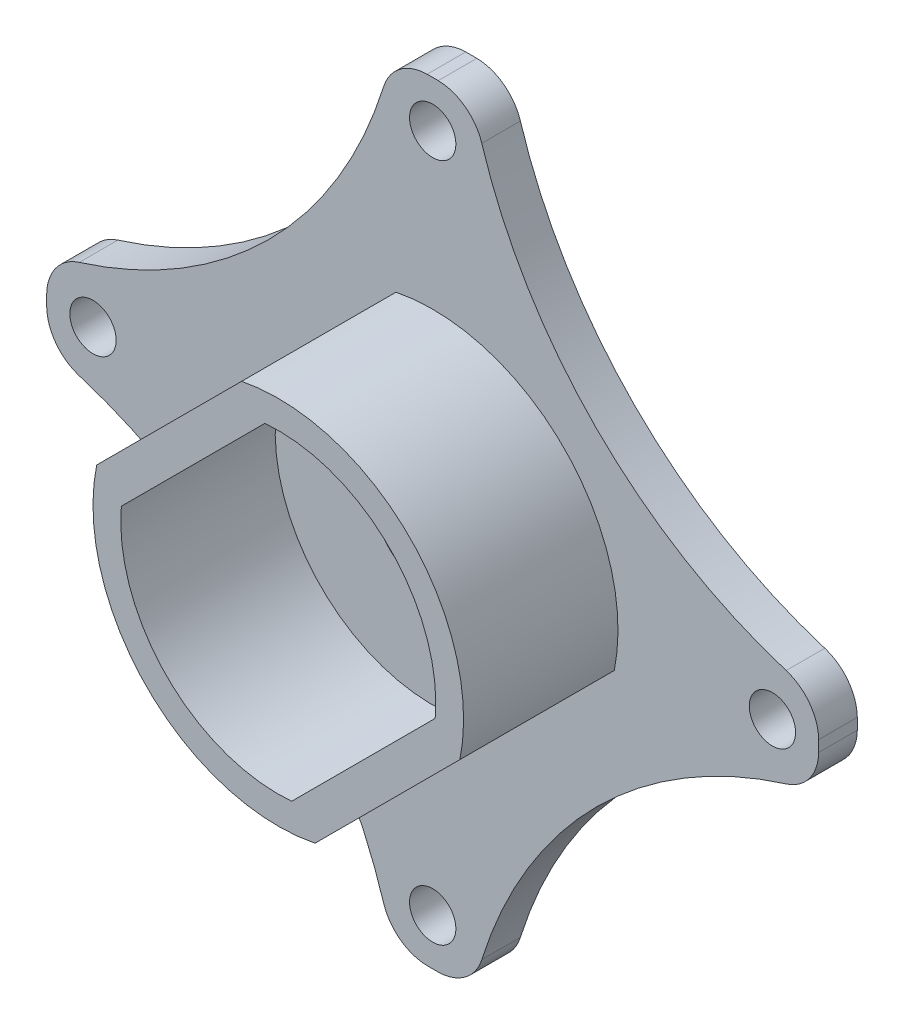
ISO-10303-21;
HEADER;
FILE_DESCRIPTION(('STEP AP214'),'2;1');
FILE_NAME('part.step','',(''),(''),'','','');
FILE_SCHEMA(('AUTOMOTIVE_DESIGN { 1 0 10303 214 1 1 1 1 }'));
ENDSEC;
DATA;
#1=APPLICATION_CONTEXT('core data for automotive mechanical design processes');
#2=APPLICATION_PROTOCOL_DEFINITION('international standard','automotive_design',2000,#1);
#3=PRODUCT_CONTEXT('',#1,'mechanical');
#4=PRODUCT('Part','Part','',(#3));
#5=PRODUCT_RELATED_PRODUCT_CATEGORY('part','',(#4));
#6=PRODUCT_DEFINITION_FORMATION('','',#4);
#7=PRODUCT_DEFINITION_CONTEXT('part definition',#1,'design');
#8=PRODUCT_DEFINITION('design','',#6,#7);
#9=PRODUCT_DEFINITION_SHAPE('','',#8);
#10=(LENGTH_UNIT() NAMED_UNIT(*) SI_UNIT(.MILLI.,.METRE.));
#11=(NAMED_UNIT(*) PLANE_ANGLE_UNIT() SI_UNIT($,.RADIAN.));
#12=(NAMED_UNIT(*) SI_UNIT($,.STERADIAN.) SOLID_ANGLE_UNIT());
#13=UNCERTAINTY_MEASURE_WITH_UNIT(LENGTH_MEASURE(1.E-05),#10,'distance_accuracy_value','');
#14=(GEOMETRIC_REPRESENTATION_CONTEXT(3) GLOBAL_UNCERTAINTY_ASSIGNED_CONTEXT((#13)) GLOBAL_UNIT_ASSIGNED_CONTEXT((#10,
#11,#12)) REPRESENTATION_CONTEXT('',''));
#15=CARTESIAN_POINT('',(0.,0.,0.));
#16=DIRECTION('',(0.,0.,1.));
#17=DIRECTION('',(1.,0.,0.));
#18=AXIS2_PLACEMENT_3D('',#15,#16,#17);
#19=CARTESIAN_POINT('',(0.,0.,2.5));
#20=DIRECTION('',(0.,0.,1.));
#21=DIRECTION('',(1.,0.,0.));
#22=AXIS2_PLACEMENT_3D('',#19,#20,#21);
#23=PLANE('',#22);
#24=CARTESIAN_POINT('',(31.8198051533946,31.8198051533947,2.5));
#25=DIRECTION('',(0.,0.,1.));
#26=DIRECTION('',(1.,0.,0.));
#27=AXIS2_PLACEMENT_3D('',#24,#25,#26);
#28=CIRCLE('',#27,30.);
#29=CARTESIAN_POINT('',(3.17944446720614,22.8906540310857,2.5));
#30=VERTEX_POINT('',#29);
#31=CARTESIAN_POINT('',(22.8906540310857,3.17944446720621,2.5));
#32=VERTEX_POINT('',#31);
#33=EDGE_CURVE('E285',#30,#32,#28,.T.);
#34=ORIENTED_EDGE('',*,*,#33,.F.);
#35=CARTESIAN_POINT('',(0.315408398587288,21.9977389188548,2.5));
#36=DIRECTION('',(0.,0.,1.));
#37=DIRECTION('',(1.,0.,0.));
#38=AXIS2_PLACEMENT_3D('',#35,#36,#37);
#39=CIRCLE('',#38,3.);
#40=CARTESIAN_POINT('',(0.358418634758282,24.9974305896078,2.5));
#41=VERTEX_POINT('',#40);
#42=EDGE_CURVE('E378',#30,#41,#39,.T.);
#43=ORIENTED_EDGE('',*,*,#42,.T.);
#44=CARTESIAN_POINT('',(0.,0.,2.5));
#45=DIRECTION('',(0.,0.,1.));
#46=DIRECTION('',(1.,0.,0.));
#47=AXIS2_PLACEMENT_3D('',#44,#45,#46);
#48=CIRCLE('',#47,25.);
#49=CARTESIAN_POINT('',(-0.358418634758457,24.9974305896078,2.5));
#50=VERTEX_POINT('',#49);
#51=EDGE_CURVE('E331',#41,#50,#48,.T.);
#52=ORIENTED_EDGE('',*,*,#51,.T.);
#53=CARTESIAN_POINT('',(-0.315408398587442,21.9977389188548,2.5));
#54=DIRECTION('',(0.,0.,1.));
#55=DIRECTION('',(1.,0.,0.));
#56=AXIS2_PLACEMENT_3D('',#53,#54,#55);
#57=CIRCLE('',#56,3.);
#58=CARTESIAN_POINT('',(-3.17944446720629,22.8906540310857,2.5));
#59=VERTEX_POINT('',#58);
#60=EDGE_CURVE('E376',#50,#59,#57,.T.);
#61=ORIENTED_EDGE('',*,*,#60,.T.);
#62=CARTESIAN_POINT('',(-31.8198051533948,31.8198051533945,2.5));
#63=DIRECTION('',(0.,0.,1.));
#64=DIRECTION('',(1.,0.,0.));
#65=AXIS2_PLACEMENT_3D('',#62,#63,#64);
#66=CIRCLE('',#65,30.);
#67=CARTESIAN_POINT('',(-22.8906540310857,3.17944446720605,2.5));
#68=VERTEX_POINT('',#67);
#69=EDGE_CURVE('E294',#68,#59,#66,.T.);
#70=ORIENTED_EDGE('',*,*,#69,.F.);
#71=CARTESIAN_POINT('',(-21.9977389188548,0.315408398587206,2.5));
#72=DIRECTION('',(0.,0.,1.));
#73=DIRECTION('',(1.,0.,0.));
#74=AXIS2_PLACEMENT_3D('',#71,#72,#73);
#75=CIRCLE('',#74,3.);
#76=CARTESIAN_POINT('',(-24.9974305896078,0.358418634758189,2.5));
#77=VERTEX_POINT('',#76);
#78=EDGE_CURVE('E374',#68,#77,#75,.T.);
#79=ORIENTED_EDGE('',*,*,#78,.T.);
#80=CARTESIAN_POINT('',(-24.9974305896078,-0.358418634758548,2.5));
#81=VERTEX_POINT('',#80);
#82=EDGE_CURVE('E453',#77,#81,#48,.T.);
#83=ORIENTED_EDGE('',*,*,#82,.T.);
#84=CARTESIAN_POINT('',(-21.9977389188548,-0.315408398587522,2.5));
#85=DIRECTION('',(0.,0.,1.));
#86=DIRECTION('',(1.,0.,0.));
#87=AXIS2_PLACEMENT_3D('',#84,#85,#86);
#88=CIRCLE('',#87,3.);
#89=CARTESIAN_POINT('',(-22.8906540310857,-3.17944446720637,2.5));
#90=VERTEX_POINT('',#89);
#91=EDGE_CURVE('E372',#81,#90,#88,.T.);
#92=ORIENTED_EDGE('',*,*,#91,.T.);
#93=CARTESIAN_POINT('',(-31.8198051533944,-31.8198051533949,2.5));
#94=DIRECTION('',(0.,0.,1.));
#95=DIRECTION('',(1.,0.,0.));
#96=AXIS2_PLACEMENT_3D('',#93,#94,#95);
#97=CIRCLE('',#96,30.);
#98=CARTESIAN_POINT('',(-3.17944446720598,-22.8906540310857,2.5));
#99=VERTEX_POINT('',#98);
#100=EDGE_CURVE('E291',#99,#90,#97,.T.);
#101=ORIENTED_EDGE('',*,*,#100,.F.);
#102=CARTESIAN_POINT('',(-0.315408398587139,-21.9977389188548,2.5));
#103=DIRECTION('',(0.,0.,1.));
#104=DIRECTION('',(1.,0.,0.));
#105=AXIS2_PLACEMENT_3D('',#102,#103,#104);
#106=CIRCLE('',#105,3.);
#107=CARTESIAN_POINT('',(-0.358418634758112,-24.9974305896078,2.5));
#108=VERTEX_POINT('',#107);
#109=EDGE_CURVE('E370',#99,#108,#106,.T.);
#110=ORIENTED_EDGE('',*,*,#109,.T.);
#111=CARTESIAN_POINT('',(0.358418634758633,-24.9974305896078,2.5));
#112=VERTEX_POINT('',#111);
#113=EDGE_CURVE('E329',#108,#112,#48,.T.);
#114=ORIENTED_EDGE('',*,*,#113,.T.);
#115=CARTESIAN_POINT('',(0.315408398587597,-21.9977389188548,2.5));
#116=DIRECTION('',(0.,0.,1.));
#117=DIRECTION('',(1.,0.,0.));
#118=AXIS2_PLACEMENT_3D('',#115,#116,#117);
#119=CIRCLE('',#118,3.);
#120=CARTESIAN_POINT('',(3.17944446720645,-22.8906540310857,2.5));
#121=VERTEX_POINT('',#120);
#122=EDGE_CURVE('E368',#112,#121,#119,.T.);
#123=ORIENTED_EDGE('',*,*,#122,.T.);
#124=CARTESIAN_POINT('',(31.819805153395,-31.8198051533942,2.5));
#125=DIRECTION('',(0.,0.,1.));
#126=DIRECTION('',(1.,0.,0.));
#127=AXIS2_PLACEMENT_3D('',#124,#125,#126);
#128=CIRCLE('',#127,30.);
#129=CARTESIAN_POINT('',(22.8906540310858,-3.17944446720589,2.5));
#130=VERTEX_POINT('',#129);
#131=EDGE_CURVE('E288',#130,#121,#128,.T.);
#132=ORIENTED_EDGE('',*,*,#131,.F.);
#133=CARTESIAN_POINT('',(21.9977389188548,-0.315408398587054,2.5));
#134=DIRECTION('',(0.,0.,1.));
#135=DIRECTION('',(1.,0.,0.));
#136=AXIS2_PLACEMENT_3D('',#133,#134,#135);
#137=CIRCLE('',#136,3.);
#138=CARTESIAN_POINT('',(24.9974305896078,-0.358418634758015,2.5));
#139=VERTEX_POINT('',#138);
#140=EDGE_CURVE('E366',#130,#139,#137,.T.);
#141=ORIENTED_EDGE('',*,*,#140,.T.);
#142=CARTESIAN_POINT('',(24.9974305896078,0.358418634758364,2.5));
#143=VERTEX_POINT('',#142);
#144=EDGE_CURVE('E326',#139,#143,#48,.T.);
#145=ORIENTED_EDGE('',*,*,#144,.T.);
#146=CARTESIAN_POINT('',(21.9977389188548,0.315408398587361,2.5));
#147=DIRECTION('',(0.,0.,1.));
#148=DIRECTION('',(1.,0.,0.));
#149=AXIS2_PLACEMENT_3D('',#146,#147,#148);
#150=CIRCLE('',#149,3.);
#151=EDGE_CURVE('E364',#143,#32,#150,.T.);
#152=ORIENTED_EDGE('',*,*,#151,.T.);
#153=EDGE_LOOP('',(#34,#43,#52,#61,#70,#79,#83,#92,#101,#110,#114,#123,#132,#141,#145,#152));
#154=FACE_BOUND('',#153,.T.);
#155=CARTESIAN_POINT('',(22.,-2.26077837006677E-12,2.5));
#156=DIRECTION('',(0.,0.,1.));
#157=DIRECTION('',(1.,0.,0.));
#158=AXIS2_PLACEMENT_3D('',#155,#156,#157);
#159=CIRCLE('',#158,1.5);
#160=CARTESIAN_POINT('',(23.5,-2.26077837006677E-12,2.5));
#161=VERTEX_POINT('',#160);
#162=EDGE_CURVE('E308',#161,#161,#159,.T.);
#163=ORIENTED_EDGE('',*,*,#162,.F.);
#164=EDGE_LOOP('',(#163));
#165=FACE_BOUND('',#164,.T.);
#166=CARTESIAN_POINT('',(0.,22.,2.5));
#167=DIRECTION('',(0.,0.,1.));
#168=DIRECTION('',(1.,0.,0.));
#169=AXIS2_PLACEMENT_3D('',#166,#167,#168);
#170=CIRCLE('',#169,1.5);
#171=CARTESIAN_POINT('',(1.5,22.,2.5));
#172=VERTEX_POINT('',#171);
#173=EDGE_CURVE('E320',#172,#172,#170,.T.);
#174=ORIENTED_EDGE('',*,*,#173,.F.);
#175=EDGE_LOOP('',(#174));
#176=FACE_BOUND('',#175,.T.);
#177=CARTESIAN_POINT('',(-22.,-2.25991100832879E-12,2.5));
#178=DIRECTION('',(0.,0.,1.));
#179=DIRECTION('',(-1.,0.,0.));
#180=AXIS2_PLACEMENT_3D('',#177,#178,#179);
#181=CIRCLE('',#180,1.5);
#182=CARTESIAN_POINT('',(-23.5,-2.25991100832879E-12,2.5));
#183=VERTEX_POINT('',#182);
#184=EDGE_CURVE('E314',#183,#183,#181,.T.);
#185=ORIENTED_EDGE('',*,*,#184,.F.);
#186=EDGE_LOOP('',(#185));
#187=FACE_BOUND('',#186,.T.);
#188=CARTESIAN_POINT('',(-4.52068937839556E-12,-22.,2.5));
#189=DIRECTION('',(0.,0.,1.));
#190=DIRECTION('',(1.,0.,0.));
#191=AXIS2_PLACEMENT_3D('',#188,#189,#190);
#192=CIRCLE('',#191,1.5);
#193=CARTESIAN_POINT('',(1.49999999999548,-22.,2.5));
#194=VERTEX_POINT('',#193);
#195=EDGE_CURVE('E301',#194,#194,#192,.T.);
#196=ORIENTED_EDGE('',*,*,#195,.F.);
#197=EDGE_LOOP('',(#196));
#198=FACE_BOUND('',#197,.T.);
#199=DIRECTION('',(0.707106781186544,0.707106781186551,0.));
#200=VECTOR('',#199,1.);
#201=CARTESIAN_POINT('',(2.38065205204211,-11.7614835716889,2.5));
#202=LINE('',#201,#200);
#203=CARTESIAN_POINT('',(2.38065205204211,-11.7614835716889,2.5));
#204=VERTEX_POINT('',#203);
#205=CARTESIAN_POINT('',(11.7614835716889,-2.38065205204198,2.5));
#206=VERTEX_POINT('',#205);
#207=EDGE_CURVE('E260',#204,#206,#202,.T.);
#208=ORIENTED_EDGE('',*,*,#207,.F.);
#209=CARTESIAN_POINT('',(0.,0.,2.5));
#210=DIRECTION('',(0.,0.,1.));
#211=DIRECTION('',(1.,0.,0.));
#212=AXIS2_PLACEMENT_3D('',#209,#210,#211);
#213=CIRCLE('',#212,12.);
#214=CARTESIAN_POINT('',(-11.7614835716889,2.38065205204198,2.5));
#215=VERTEX_POINT('',#214);
#216=EDGE_CURVE('E225',#215,#204,#213,.T.);
#217=ORIENTED_EDGE('',*,*,#216,.F.);
#218=DIRECTION('',(-0.707106781186544,-0.707106781186552,0.));
#219=VECTOR('',#218,1.);
#220=CARTESIAN_POINT('',(-11.7614835716889,2.38065205204198,2.5));
#221=LINE('',#220,#219);
#222=CARTESIAN_POINT('',(-2.38065205204211,11.7614835716889,2.5));
#223=VERTEX_POINT('',#222);
#224=EDGE_CURVE('E251',#223,#215,#221,.T.);
#225=ORIENTED_EDGE('',*,*,#224,.F.);
#226=CARTESIAN_POINT('',(0.,0.,2.5));
#227=DIRECTION('',(0.,0.,1.));
#228=DIRECTION('',(1.,0.,0.));
#229=AXIS2_PLACEMENT_3D('',#226,#227,#228);
#230=CIRCLE('',#229,12.);
#231=EDGE_CURVE('E262',#206,#223,#230,.T.);
#232=ORIENTED_EDGE('',*,*,#231,.F.);
#233=EDGE_LOOP('',(#208,#217,#225,#232));
#234=FACE_BOUND('',#233,.T.);
#235=ADVANCED_FACE('F45',(#154,#165,#176,#187,#198,#234),#23,.T.);
#236=CARTESIAN_POINT('',(0.,0.,2.5));
#237=DIRECTION('',(0.,0.,-1.));
#238=DIRECTION('',(-1.,0.,0.));
#239=AXIS2_PLACEMENT_3D('',#236,#237,#238);
#240=CYLINDRICAL_SURFACE('',#239,25.);
#241=ORIENTED_EDGE('',*,*,#51,.F.);
#242=DIRECTION('',(0.,0.,-1.));
#243=VECTOR('',#242,1.);
#244=CARTESIAN_POINT('',(0.358418634758282,24.9974305896078,2.5));
#245=LINE('',#244,#243);
#246=CARTESIAN_POINT('',(0.358418634758282,24.9974305896078,0.));
#247=VERTEX_POINT('',#246);
#248=EDGE_CURVE('E341',#41,#247,#245,.T.);
#249=ORIENTED_EDGE('',*,*,#248,.T.);
#250=CARTESIAN_POINT('',(0.,0.,0.));
#251=DIRECTION('',(0.,0.,1.));
#252=DIRECTION('',(1.,0.,0.));
#253=AXIS2_PLACEMENT_3D('',#250,#251,#252);
#254=CIRCLE('',#253,25.);
#255=CARTESIAN_POINT('',(-0.358418634758457,24.9974305896078,0.));
#256=VERTEX_POINT('',#255);
#257=EDGE_CURVE('E330',#247,#256,#254,.T.);
#258=ORIENTED_EDGE('',*,*,#257,.T.);
#259=DIRECTION('',(0.,0.,-1.));
#260=VECTOR('',#259,1.);
#261=CARTESIAN_POINT('',(-0.358418634758457,24.9974305896078,2.5));
#262=LINE('',#261,#260);
#263=EDGE_CURVE('E338',#256,#50,#262,.F.);
#264=ORIENTED_EDGE('',*,*,#263,.T.);
#265=EDGE_LOOP('',(#241,#249,#258,#264));
#266=FACE_BOUND('',#265,.T.);
#267=ADVANCED_FACE('F435',(#266),#240,.T.);
#268=ORIENTED_EDGE('',*,*,#82,.F.);
#269=DIRECTION('',(0.,0.,-1.));
#270=VECTOR('',#269,1.);
#271=CARTESIAN_POINT('',(-24.9974305896078,0.358418634758189,2.5));
#272=LINE('',#271,#270);
#273=CARTESIAN_POINT('',(-24.9974305896078,0.358418634758189,0.));
#274=VERTEX_POINT('',#273);
#275=EDGE_CURVE('E387',#77,#274,#272,.T.);
#276=ORIENTED_EDGE('',*,*,#275,.T.);
#277=CARTESIAN_POINT('',(-24.9974305896078,-0.358418634758548,0.));
#278=VERTEX_POINT('',#277);
#279=EDGE_CURVE('E335',#274,#278,#254,.T.);
#280=ORIENTED_EDGE('',*,*,#279,.T.);
#281=DIRECTION('',(0.,0.,-1.));
#282=VECTOR('',#281,1.);
#283=CARTESIAN_POINT('',(-24.9974305896078,-0.358418634758548,2.5));
#284=LINE('',#283,#282);
#285=EDGE_CURVE('E384',#278,#81,#284,.F.);
#286=ORIENTED_EDGE('',*,*,#285,.T.);
#287=EDGE_LOOP('',(#268,#276,#280,#286));
#288=FACE_BOUND('',#287,.T.);
#289=ADVANCED_FACE('F454',(#288),#240,.T.);
#290=ORIENTED_EDGE('',*,*,#113,.F.);
#291=DIRECTION('',(0.,0.,-1.));
#292=VECTOR('',#291,1.);
#293=CARTESIAN_POINT('',(-0.358418634758112,-24.9974305896078,2.5));
#294=LINE('',#293,#292);
#295=CARTESIAN_POINT('',(-0.358418634758112,-24.9974305896078,0.));
#296=VERTEX_POINT('',#295);
#297=EDGE_CURVE('E397',#108,#296,#294,.T.);
#298=ORIENTED_EDGE('',*,*,#297,.T.);
#299=CARTESIAN_POINT('',(0.358418634758633,-24.9974305896078,0.));
#300=VERTEX_POINT('',#299);
#301=EDGE_CURVE('E332',#296,#300,#254,.T.);
#302=ORIENTED_EDGE('',*,*,#301,.T.);
#303=DIRECTION('',(0.,0.,-1.));
#304=VECTOR('',#303,1.);
#305=CARTESIAN_POINT('',(0.358418634758633,-24.9974305896078,2.5));
#306=LINE('',#305,#304);
#307=EDGE_CURVE('E394',#300,#112,#306,.F.);
#308=ORIENTED_EDGE('',*,*,#307,.T.);
#309=EDGE_LOOP('',(#290,#298,#302,#308));
#310=FACE_BOUND('',#309,.T.);
#311=ADVANCED_FACE('F461',(#310),#240,.T.);
#312=CARTESIAN_POINT('',(0.,0.,2.5));
#313=DIRECTION('',(0.,0.,1.));
#314=DIRECTION('',(1.,0.,0.));
#315=AXIS2_PLACEMENT_3D('',#312,#313,#314);
#316=CIRCLE('',#315,10.2);
#317=CARTESIAN_POINT('',(-10.163012908704,0.867852877806112,2.5));
#318=VERTEX_POINT('',#317);
#319=CARTESIAN_POINT('',(0.867852877806223,-10.163012908704,2.5));
#320=VERTEX_POINT('',#319);
#321=EDGE_CURVE('E68',#318,#320,#316,.T.);
#322=ORIENTED_EDGE('',*,*,#321,.T.);
#323=DIRECTION('',(0.707106781186544,0.707106781186551,0.));
#324=VECTOR('',#323,1.);
#325=CARTESIAN_POINT('',(0.867852877806221,-10.163012908704,2.5));
#326=LINE('',#325,#324);
#327=CARTESIAN_POINT('',(10.163012908704,-0.867852877806111,2.5));
#328=VERTEX_POINT('',#327);
#329=EDGE_CURVE('E224',#320,#328,#326,.T.);
#330=ORIENTED_EDGE('',*,*,#329,.T.);
#331=CARTESIAN_POINT('',(0.,0.,2.5));
#332=DIRECTION('',(0.,0.,1.));
#333=DIRECTION('',(1.,0.,0.));
#334=AXIS2_PLACEMENT_3D('',#331,#332,#333);
#335=CIRCLE('',#334,10.2);
#336=CARTESIAN_POINT('',(-0.867852877806228,10.163012908704,2.5));
#337=VERTEX_POINT('',#336);
#338=EDGE_CURVE('E239',#328,#337,#335,.T.);
#339=ORIENTED_EDGE('',*,*,#338,.T.);
#340=DIRECTION('',(-0.707106781186543,-0.707106781186552,0.));
#341=VECTOR('',#340,1.);
#342=CARTESIAN_POINT('',(-10.163012908704,0.867852877806112,2.5));
#343=LINE('',#342,#341);
#344=EDGE_CURVE('E218',#337,#318,#343,.T.);
#345=ORIENTED_EDGE('',*,*,#344,.T.);
#346=EDGE_LOOP('',(#322,#330,#339,#345));
#347=FACE_BOUND('',#346,.T.);
#348=CARTESIAN_POINT('',(0.,0.,2.5));
#349=DIRECTION('',(0.,0.,-1.));
#350=DIRECTION('',(-1.,0.,0.));
#351=AXIS2_PLACEMENT_3D('',#348,#349,#350);
#352=CIRCLE('',#351,4.);
#353=CARTESIAN_POINT('',(-4.,0.,2.5));
#354=VERTEX_POINT('',#353);
#355=EDGE_CURVE('E297',#354,#354,#352,.T.);
#356=ORIENTED_EDGE('',*,*,#355,.T.);
#357=EDGE_LOOP('',(#356));
#358=FACE_BOUND('',#357,.T.);
#359=ADVANCED_FACE('F485',(#347,#358),#23,.T.);
#360=CARTESIAN_POINT('',(0.,0.,0.));
#361=DIRECTION('',(0.,0.,1.));
#362=DIRECTION('',(1.,0.,0.));
#363=AXIS2_PLACEMENT_3D('',#360,#361,#362);
#364=PLANE('',#363);
#365=CARTESIAN_POINT('',(0.,0.,0.));
#366=DIRECTION('',(0.,0.,1.));
#367=DIRECTION('',(1.,0.,0.));
#368=AXIS2_PLACEMENT_3D('',#365,#366,#367);
#369=CIRCLE('',#368,4.);
#370=CARTESIAN_POINT('',(4.,0.,0.));
#371=VERTEX_POINT('',#370);
#372=EDGE_CURVE('E300',#371,#371,#369,.T.);
#373=ORIENTED_EDGE('',*,*,#372,.T.);
#374=EDGE_LOOP('',(#373));
#375=FACE_BOUND('',#374,.T.);
#376=ORIENTED_EDGE('',*,*,#257,.F.);
#377=CARTESIAN_POINT('',(0.315408398587288,21.9977389188548,0.));
#378=DIRECTION('',(0.,0.,1.));
#379=DIRECTION('',(1.,0.,0.));
#380=AXIS2_PLACEMENT_3D('',#377,#378,#379);
#381=CIRCLE('',#380,3.);
#382=CARTESIAN_POINT('',(3.17944446720614,22.8906540310857,0.));
#383=VERTEX_POINT('',#382);
#384=EDGE_CURVE('E358',#247,#383,#381,.F.);
#385=ORIENTED_EDGE('',*,*,#384,.T.);
#386=CARTESIAN_POINT('',(31.8198051533946,31.8198051533947,0.));
#387=DIRECTION('',(0.,0.,-1.));
#388=DIRECTION('',(-1.,0.,0.));
#389=AXIS2_PLACEMENT_3D('',#386,#387,#388);
#390=CIRCLE('',#389,30.);
#391=CARTESIAN_POINT('',(22.8906540310857,3.17944446720621,0.));
#392=VERTEX_POINT('',#391);
#393=EDGE_CURVE('E277',#392,#383,#390,.T.);
#394=ORIENTED_EDGE('',*,*,#393,.F.);
#395=CARTESIAN_POINT('',(21.9977389188548,0.315408398587361,0.));
#396=DIRECTION('',(0.,0.,1.));
#397=DIRECTION('',(1.,0.,0.));
#398=AXIS2_PLACEMENT_3D('',#395,#396,#397);
#399=CIRCLE('',#398,3.);
#400=CARTESIAN_POINT('',(24.9974305896078,0.358418634758364,0.));
#401=VERTEX_POINT('',#400);
#402=EDGE_CURVE('E344',#392,#401,#399,.F.);
#403=ORIENTED_EDGE('',*,*,#402,.T.);
#404=CARTESIAN_POINT('',(24.9974305896078,-0.358418634758015,0.));
#405=VERTEX_POINT('',#404);
#406=EDGE_CURVE('E323',#405,#401,#254,.T.);
#407=ORIENTED_EDGE('',*,*,#406,.F.);
#408=CARTESIAN_POINT('',(21.9977389188548,-0.315408398587054,0.));
#409=DIRECTION('',(0.,0.,1.));
#410=DIRECTION('',(1.,0.,0.));
#411=AXIS2_PLACEMENT_3D('',#408,#409,#410);
#412=CIRCLE('',#411,3.);
#413=CARTESIAN_POINT('',(22.8906540310858,-3.17944446720589,0.));
#414=VERTEX_POINT('',#413);
#415=EDGE_CURVE('E346',#405,#414,#412,.F.);
#416=ORIENTED_EDGE('',*,*,#415,.T.);
#417=CARTESIAN_POINT('',(31.819805153395,-31.8198051533942,0.));
#418=DIRECTION('',(0.,0.,-1.));
#419=DIRECTION('',(-1.,0.,0.));
#420=AXIS2_PLACEMENT_3D('',#417,#418,#419);
#421=CIRCLE('',#420,30.);
#422=CARTESIAN_POINT('',(3.17944446720645,-22.8906540310857,0.));
#423=VERTEX_POINT('',#422);
#424=EDGE_CURVE('E274',#423,#414,#421,.T.);
#425=ORIENTED_EDGE('',*,*,#424,.F.);
#426=CARTESIAN_POINT('',(0.315408398587597,-21.9977389188548,0.));
#427=DIRECTION('',(0.,0.,1.));
#428=DIRECTION('',(1.,0.,0.));
#429=AXIS2_PLACEMENT_3D('',#426,#427,#428);
#430=CIRCLE('',#429,3.);
#431=EDGE_CURVE('E348',#423,#300,#430,.F.);
#432=ORIENTED_EDGE('',*,*,#431,.T.);
#433=ORIENTED_EDGE('',*,*,#301,.F.);
#434=CARTESIAN_POINT('',(-0.315408398587139,-21.9977389188548,0.));
#435=DIRECTION('',(0.,0.,1.));
#436=DIRECTION('',(1.,0.,0.));
#437=AXIS2_PLACEMENT_3D('',#434,#435,#436);
#438=CIRCLE('',#437,3.);
#439=CARTESIAN_POINT('',(-3.17944446720598,-22.8906540310857,0.));
#440=VERTEX_POINT('',#439);
#441=EDGE_CURVE('E350',#296,#440,#438,.F.);
#442=ORIENTED_EDGE('',*,*,#441,.T.);
#443=CARTESIAN_POINT('',(-31.8198051533944,-31.8198051533949,0.));
#444=DIRECTION('',(0.,0.,-1.));
#445=DIRECTION('',(-1.,0.,0.));
#446=AXIS2_PLACEMENT_3D('',#443,#444,#445);
#447=CIRCLE('',#446,30.);
#448=CARTESIAN_POINT('',(-22.8906540310857,-3.17944446720637,0.));
#449=VERTEX_POINT('',#448);
#450=EDGE_CURVE('E278',#449,#440,#447,.T.);
#451=ORIENTED_EDGE('',*,*,#450,.F.);
#452=CARTESIAN_POINT('',(-21.9977389188548,-0.315408398587522,0.));
#453=DIRECTION('',(0.,0.,1.));
#454=DIRECTION('',(1.,0.,0.));
#455=AXIS2_PLACEMENT_3D('',#452,#453,#454);
#456=CIRCLE('',#455,3.);
#457=EDGE_CURVE('E352',#449,#278,#456,.F.);
#458=ORIENTED_EDGE('',*,*,#457,.T.);
#459=ORIENTED_EDGE('',*,*,#279,.F.);
#460=CARTESIAN_POINT('',(-21.9977389188548,0.315408398587206,0.));
#461=DIRECTION('',(0.,0.,1.));
#462=DIRECTION('',(1.,0.,0.));
#463=AXIS2_PLACEMENT_3D('',#460,#461,#462);
#464=CIRCLE('',#463,3.);
#465=CARTESIAN_POINT('',(-22.8906540310857,3.17944446720605,0.));
#466=VERTEX_POINT('',#465);
#467=EDGE_CURVE('E354',#274,#466,#464,.F.);
#468=ORIENTED_EDGE('',*,*,#467,.T.);
#469=CARTESIAN_POINT('',(-31.8198051533948,31.8198051533945,0.));
#470=DIRECTION('',(0.,0.,-1.));
#471=DIRECTION('',(-1.,0.,0.));
#472=AXIS2_PLACEMENT_3D('',#469,#470,#471);
#473=CIRCLE('',#472,30.);
#474=CARTESIAN_POINT('',(-3.17944446720629,22.8906540310857,0.));
#475=VERTEX_POINT('',#474);
#476=EDGE_CURVE('E273',#475,#466,#473,.T.);
#477=ORIENTED_EDGE('',*,*,#476,.F.);
#478=CARTESIAN_POINT('',(-0.315408398587442,21.9977389188548,0.));
#479=DIRECTION('',(0.,0.,1.));
#480=DIRECTION('',(1.,0.,0.));
#481=AXIS2_PLACEMENT_3D('',#478,#479,#480);
#482=CIRCLE('',#481,3.);
#483=EDGE_CURVE('E356',#475,#256,#482,.F.);
#484=ORIENTED_EDGE('',*,*,#483,.T.);
#485=EDGE_LOOP('',(#376,#385,#394,#403,#407,#416,#425,#432,#433,#442,#451,#458,#459,#468,#477,#484));
#486=FACE_BOUND('',#485,.T.);
#487=CARTESIAN_POINT('',(0.,22.,0.));
#488=DIRECTION('',(0.,0.,1.));
#489=DIRECTION('',(1.,0.,0.));
#490=AXIS2_PLACEMENT_3D('',#487,#488,#489);
#491=CIRCLE('',#490,1.5);
#492=CARTESIAN_POINT('',(1.5,22.,0.));
#493=VERTEX_POINT('',#492);
#494=EDGE_CURVE('E317',#493,#493,#491,.T.);
#495=ORIENTED_EDGE('',*,*,#494,.T.);
#496=EDGE_LOOP('',(#495));
#497=FACE_BOUND('',#496,.T.);
#498=CARTESIAN_POINT('',(-22.,-2.25991100832879E-12,0.));
#499=DIRECTION('',(0.,0.,1.));
#500=DIRECTION('',(-1.,0.,0.));
#501=AXIS2_PLACEMENT_3D('',#498,#499,#500);
#502=CIRCLE('',#501,1.5);
#503=CARTESIAN_POINT('',(-23.5,-2.25991100832879E-12,0.));
#504=VERTEX_POINT('',#503);
#505=EDGE_CURVE('E311',#504,#504,#502,.T.);
#506=ORIENTED_EDGE('',*,*,#505,.T.);
#507=EDGE_LOOP('',(#506));
#508=FACE_BOUND('',#507,.T.);
#509=CARTESIAN_POINT('',(22.,-2.26077837006677E-12,0.));
#510=DIRECTION('',(0.,0.,1.));
#511=DIRECTION('',(1.,0.,0.));
#512=AXIS2_PLACEMENT_3D('',#509,#510,#511);
#513=CIRCLE('',#512,1.5);
#514=CARTESIAN_POINT('',(23.5,-2.26077837006677E-12,0.));
#515=VERTEX_POINT('',#514);
#516=EDGE_CURVE('E304',#515,#515,#513,.T.);
#517=ORIENTED_EDGE('',*,*,#516,.T.);
#518=EDGE_LOOP('',(#517));
#519=FACE_BOUND('',#518,.T.);
#520=CARTESIAN_POINT('',(-4.52068937839556E-12,-22.,0.));
#521=DIRECTION('',(0.,0.,1.));
#522=DIRECTION('',(1.,0.,0.));
#523=AXIS2_PLACEMENT_3D('',#520,#521,#522);
#524=CIRCLE('',#523,1.5);
#525=CARTESIAN_POINT('',(1.49999999999548,-22.,0.));
#526=VERTEX_POINT('',#525);
#527=EDGE_CURVE('E305',#526,#526,#524,.T.);
#528=ORIENTED_EDGE('',*,*,#527,.T.);
#529=EDGE_LOOP('',(#528));
#530=FACE_BOUND('',#529,.T.);
#531=ADVANCED_FACE('F423',(#375,#486,#497,#508,#519,#530),#364,.F.);
#532=ORIENTED_EDGE('',*,*,#144,.F.);
#533=DIRECTION('',(0.,0.,-1.));
#534=VECTOR('',#533,1.);
#535=CARTESIAN_POINT('',(24.9974305896078,-0.358418634758015,2.5));
#536=LINE('',#535,#534);
#537=EDGE_CURVE('E11',#139,#405,#536,.T.);
#538=ORIENTED_EDGE('',*,*,#537,.T.);
#539=ORIENTED_EDGE('',*,*,#406,.T.);
#540=DIRECTION('',(0.,0.,-1.));
#541=VECTOR('',#540,1.);
#542=CARTESIAN_POINT('',(24.9974305896078,0.358418634758364,2.5));
#543=LINE('',#542,#541);
#544=EDGE_CURVE('E53',#401,#143,#543,.F.);
#545=ORIENTED_EDGE('',*,*,#544,.T.);
#546=EDGE_LOOP('',(#532,#538,#539,#545));
#547=FACE_BOUND('',#546,.T.);
#548=ADVANCED_FACE('F408',(#547),#240,.T.);
#549=CARTESIAN_POINT('',(0.,22.,2.5));
#550=DIRECTION('',(0.,0.,-1.));
#551=DIRECTION('',(-1.,0.,0.));
#552=AXIS2_PLACEMENT_3D('',#549,#550,#551);
#553=CYLINDRICAL_SURFACE('',#552,1.5);
#554=ORIENTED_EDGE('',*,*,#173,.T.);
#555=EDGE_LOOP('',(#554));
#556=FACE_BOUND('',#555,.T.);
#557=ORIENTED_EDGE('',*,*,#494,.F.);
#558=EDGE_LOOP('',(#557));
#559=FACE_BOUND('',#558,.T.);
#560=ADVANCED_FACE('F527',(#556,#559),#553,.F.);
#561=CARTESIAN_POINT('',(-22.,-2.25991100832879E-12,2.5));
#562=DIRECTION('',(0.,0.,-1.));
#563=DIRECTION('',(-1.,0.,0.));
#564=AXIS2_PLACEMENT_3D('',#561,#562,#563);
#565=CYLINDRICAL_SURFACE('',#564,1.5);
#566=ORIENTED_EDGE('',*,*,#184,.T.);
#567=EDGE_LOOP('',(#566));
#568=FACE_BOUND('',#567,.T.);
#569=ORIENTED_EDGE('',*,*,#505,.F.);
#570=EDGE_LOOP('',(#569));
#571=FACE_BOUND('',#570,.T.);
#572=ADVANCED_FACE('F524',(#568,#571),#565,.F.);
#573=CARTESIAN_POINT('',(22.,-2.26077837006677E-12,2.5));
#574=DIRECTION('',(0.,0.,-1.));
#575=DIRECTION('',(-1.,0.,0.));
#576=AXIS2_PLACEMENT_3D('',#573,#574,#575);
#577=CYLINDRICAL_SURFACE('',#576,1.5);
#578=ORIENTED_EDGE('',*,*,#162,.T.);
#579=EDGE_LOOP('',(#578));
#580=FACE_BOUND('',#579,.T.);
#581=ORIENTED_EDGE('',*,*,#516,.F.);
#582=EDGE_LOOP('',(#581));
#583=FACE_BOUND('',#582,.T.);
#584=ADVANCED_FACE('F517',(#580,#583),#577,.F.);
#585=CARTESIAN_POINT('',(-4.52068937839556E-12,-22.,2.5));
#586=DIRECTION('',(0.,0.,-1.));
#587=DIRECTION('',(-1.,0.,0.));
#588=AXIS2_PLACEMENT_3D('',#585,#586,#587);
#589=CYLINDRICAL_SURFACE('',#588,1.5);
#590=ORIENTED_EDGE('',*,*,#195,.T.);
#591=EDGE_LOOP('',(#590));
#592=FACE_BOUND('',#591,.T.);
#593=ORIENTED_EDGE('',*,*,#527,.F.);
#594=EDGE_LOOP('',(#593));
#595=FACE_BOUND('',#594,.T.);
#596=ADVANCED_FACE('F507',(#592,#595),#589,.F.);
#597=CARTESIAN_POINT('',(0.,0.,2.5));
#598=DIRECTION('',(0.,0.,-1.));
#599=DIRECTION('',(-1.,0.,0.));
#600=AXIS2_PLACEMENT_3D('',#597,#598,#599);
#601=CYLINDRICAL_SURFACE('',#600,4.);
#602=ORIENTED_EDGE('',*,*,#355,.F.);
#603=EDGE_LOOP('',(#602));
#604=FACE_BOUND('',#603,.T.);
#605=ORIENTED_EDGE('',*,*,#372,.F.);
#606=EDGE_LOOP('',(#605));
#607=FACE_BOUND('',#606,.T.);
#608=ADVANCED_FACE('F503',(#604,#607),#601,.F.);
#609=CARTESIAN_POINT('',(31.8198051533946,31.8198051533947,10.));
#610=DIRECTION('',(0.,0.,-1.));
#611=DIRECTION('',(-1.,0.,0.));
#612=AXIS2_PLACEMENT_3D('',#609,#610,#611);
#613=CYLINDRICAL_SURFACE('',#612,30.);
#614=ORIENTED_EDGE('',*,*,#393,.T.);
#615=DIRECTION('',(0.,0.,-1.));
#616=VECTOR('',#615,1.);
#617=CARTESIAN_POINT('',(3.17944446720613,22.8906540310857,10.));
#618=LINE('',#617,#616);
#619=EDGE_CURVE('E362',#383,#30,#618,.F.);
#620=ORIENTED_EDGE('',*,*,#619,.T.);
#621=ORIENTED_EDGE('',*,*,#33,.T.);
#622=DIRECTION('',(0.,0.,-1.));
#623=VECTOR('',#622,1.);
#624=CARTESIAN_POINT('',(22.8906540310857,3.17944446720621,10.));
#625=LINE('',#624,#623);
#626=EDGE_CURVE('E360',#32,#392,#625,.T.);
#627=ORIENTED_EDGE('',*,*,#626,.T.);
#628=EDGE_LOOP('',(#614,#620,#621,#627));
#629=FACE_BOUND('',#628,.T.);
#630=ADVANCED_FACE('F506',(#629),#613,.F.);
#631=CARTESIAN_POINT('',(31.819805153395,-31.8198051533942,10.));
#632=DIRECTION('',(0.,0.,-1.));
#633=DIRECTION('',(-1.,0.,0.));
#634=AXIS2_PLACEMENT_3D('',#631,#632,#633);
#635=CYLINDRICAL_SURFACE('',#634,30.);
#636=ORIENTED_EDGE('',*,*,#131,.T.);
#637=DIRECTION('',(0.,0.,-1.));
#638=VECTOR('',#637,1.);
#639=CARTESIAN_POINT('',(3.17944446720645,-22.8906540310857,10.));
#640=LINE('',#639,#638);
#641=EDGE_CURVE('E402',#121,#423,#640,.T.);
#642=ORIENTED_EDGE('',*,*,#641,.T.);
#643=ORIENTED_EDGE('',*,*,#424,.T.);
#644=DIRECTION('',(0.,0.,-1.));
#645=VECTOR('',#644,1.);
#646=CARTESIAN_POINT('',(22.8906540310858,-3.17944446720589,10.));
#647=LINE('',#646,#645);
#648=EDGE_CURVE('E400',#414,#130,#647,.F.);
#649=ORIENTED_EDGE('',*,*,#648,.T.);
#650=EDGE_LOOP('',(#636,#642,#643,#649));
#651=FACE_BOUND('',#650,.T.);
#652=ADVANCED_FACE('F514',(#651),#635,.F.);
#653=CARTESIAN_POINT('',(-31.8198051533944,-31.8198051533949,10.));
#654=DIRECTION('',(0.,0.,-1.));
#655=DIRECTION('',(-1.,0.,0.));
#656=AXIS2_PLACEMENT_3D('',#653,#654,#655);
#657=CYLINDRICAL_SURFACE('',#656,30.);
#658=ORIENTED_EDGE('',*,*,#100,.T.);
#659=DIRECTION('',(0.,0.,-1.));
#660=VECTOR('',#659,1.);
#661=CARTESIAN_POINT('',(-22.8906540310857,-3.17944446720637,10.));
#662=LINE('',#661,#660);
#663=EDGE_CURVE('E392',#90,#449,#662,.T.);
#664=ORIENTED_EDGE('',*,*,#663,.T.);
#665=ORIENTED_EDGE('',*,*,#450,.T.);
#666=DIRECTION('',(0.,0.,-1.));
#667=VECTOR('',#666,1.);
#668=CARTESIAN_POINT('',(-3.17944446720597,-22.8906540310857,10.));
#669=LINE('',#668,#667);
#670=EDGE_CURVE('E390',#440,#99,#669,.F.);
#671=ORIENTED_EDGE('',*,*,#670,.T.);
#672=EDGE_LOOP('',(#658,#664,#665,#671));
#673=FACE_BOUND('',#672,.T.);
#674=ADVANCED_FACE('F470',(#673),#657,.F.);
#675=CARTESIAN_POINT('',(-31.8198051533948,31.8198051533945,10.));
#676=DIRECTION('',(0.,0.,-1.));
#677=DIRECTION('',(-1.,0.,0.));
#678=AXIS2_PLACEMENT_3D('',#675,#676,#677);
#679=CYLINDRICAL_SURFACE('',#678,30.);
#680=ORIENTED_EDGE('',*,*,#69,.T.);
#681=DIRECTION('',(0.,0.,-1.));
#682=VECTOR('',#681,1.);
#683=CARTESIAN_POINT('',(-3.17944446720629,22.8906540310857,10.));
#684=LINE('',#683,#682);
#685=EDGE_CURVE('E382',#59,#475,#684,.T.);
#686=ORIENTED_EDGE('',*,*,#685,.T.);
#687=ORIENTED_EDGE('',*,*,#476,.T.);
#688=DIRECTION('',(0.,0.,-1.));
#689=VECTOR('',#688,1.);
#690=CARTESIAN_POINT('',(-22.8906540310857,3.17944446720605,10.));
#691=LINE('',#690,#689);
#692=EDGE_CURVE('E380',#466,#68,#691,.F.);
#693=ORIENTED_EDGE('',*,*,#692,.T.);
#694=EDGE_LOOP('',(#680,#686,#687,#693));
#695=FACE_BOUND('',#694,.T.);
#696=ADVANCED_FACE('F445',(#695),#679,.F.);
#697=CARTESIAN_POINT('',(0.315408398587288,21.9977389188548,10.));
#698=DIRECTION('',(0.,0.,1.));
#699=DIRECTION('',(1.,0.,0.));
#700=AXIS2_PLACEMENT_3D('',#697,#698,#699);
#701=CYLINDRICAL_SURFACE('',#700,3.);
#702=ORIENTED_EDGE('',*,*,#42,.F.);
#703=ORIENTED_EDGE('',*,*,#619,.F.);
#704=ORIENTED_EDGE('',*,*,#384,.F.);
#705=ORIENTED_EDGE('',*,*,#248,.F.);
#706=EDGE_LOOP('',(#702,#703,#704,#705));
#707=FACE_BOUND('',#706,.T.);
#708=ADVANCED_FACE('F588',(#707),#701,.T.);
#709=CARTESIAN_POINT('',(-0.315408398587442,21.9977389188548,10.));
#710=DIRECTION('',(0.,0.,-1.));
#711=DIRECTION('',(-1.,0.,0.));
#712=AXIS2_PLACEMENT_3D('',#709,#710,#711);
#713=CYLINDRICAL_SURFACE('',#712,3.);
#714=ORIENTED_EDGE('',*,*,#483,.F.);
#715=ORIENTED_EDGE('',*,*,#685,.F.);
#716=ORIENTED_EDGE('',*,*,#60,.F.);
#717=ORIENTED_EDGE('',*,*,#263,.F.);
#718=EDGE_LOOP('',(#714,#715,#716,#717));
#719=FACE_BOUND('',#718,.T.);
#720=ADVANCED_FACE('F440',(#719),#713,.T.);
#721=CARTESIAN_POINT('',(-21.9977389188548,0.315408398587206,10.));
#722=DIRECTION('',(0.,0.,1.));
#723=DIRECTION('',(1.,0.,0.));
#724=AXIS2_PLACEMENT_3D('',#721,#722,#723);
#725=CYLINDRICAL_SURFACE('',#724,3.);
#726=ORIENTED_EDGE('',*,*,#78,.F.);
#727=ORIENTED_EDGE('',*,*,#692,.F.);
#728=ORIENTED_EDGE('',*,*,#467,.F.);
#729=ORIENTED_EDGE('',*,*,#275,.F.);
#730=EDGE_LOOP('',(#726,#727,#728,#729));
#731=FACE_BOUND('',#730,.T.);
#732=ADVANCED_FACE('F449',(#731),#725,.T.);
#733=CARTESIAN_POINT('',(-21.9977389188548,-0.315408398587522,10.));
#734=DIRECTION('',(0.,0.,-1.));
#735=DIRECTION('',(-1.,0.,0.));
#736=AXIS2_PLACEMENT_3D('',#733,#734,#735);
#737=CYLINDRICAL_SURFACE('',#736,3.);
#738=ORIENTED_EDGE('',*,*,#457,.F.);
#739=ORIENTED_EDGE('',*,*,#663,.F.);
#740=ORIENTED_EDGE('',*,*,#91,.F.);
#741=ORIENTED_EDGE('',*,*,#285,.F.);
#742=EDGE_LOOP('',(#738,#739,#740,#741));
#743=FACE_BOUND('',#742,.T.);
#744=ADVANCED_FACE('F473',(#743),#737,.T.);
#745=CARTESIAN_POINT('',(-0.315408398587139,-21.9977389188548,10.));
#746=DIRECTION('',(0.,0.,1.));
#747=DIRECTION('',(1.,0.,0.));
#748=AXIS2_PLACEMENT_3D('',#745,#746,#747);
#749=CYLINDRICAL_SURFACE('',#748,3.);
#750=ORIENTED_EDGE('',*,*,#109,.F.);
#751=ORIENTED_EDGE('',*,*,#670,.F.);
#752=ORIENTED_EDGE('',*,*,#441,.F.);
#753=ORIENTED_EDGE('',*,*,#297,.F.);
#754=EDGE_LOOP('',(#750,#751,#752,#753));
#755=FACE_BOUND('',#754,.T.);
#756=ADVANCED_FACE('F465',(#755),#749,.T.);
#757=CARTESIAN_POINT('',(0.315408398587597,-21.9977389188548,10.));
#758=DIRECTION('',(0.,0.,-1.));
#759=DIRECTION('',(-1.,0.,0.));
#760=AXIS2_PLACEMENT_3D('',#757,#758,#759);
#761=CYLINDRICAL_SURFACE('',#760,3.);
#762=ORIENTED_EDGE('',*,*,#431,.F.);
#763=ORIENTED_EDGE('',*,*,#641,.F.);
#764=ORIENTED_EDGE('',*,*,#122,.F.);
#765=ORIENTED_EDGE('',*,*,#307,.F.);
#766=EDGE_LOOP('',(#762,#763,#764,#765));
#767=FACE_BOUND('',#766,.T.);
#768=ADVANCED_FACE('F480',(#767),#761,.T.);
#769=CARTESIAN_POINT('',(21.9977389188548,-0.315408398587054,10.));
#770=DIRECTION('',(0.,0.,1.));
#771=DIRECTION('',(1.,0.,0.));
#772=AXIS2_PLACEMENT_3D('',#769,#770,#771);
#773=CYLINDRICAL_SURFACE('',#772,3.);
#774=ORIENTED_EDGE('',*,*,#140,.F.);
#775=ORIENTED_EDGE('',*,*,#648,.F.);
#776=ORIENTED_EDGE('',*,*,#415,.F.);
#777=ORIENTED_EDGE('',*,*,#537,.F.);
#778=EDGE_LOOP('',(#774,#775,#776,#777));
#779=FACE_BOUND('',#778,.T.);
#780=ADVANCED_FACE('F420',(#779),#773,.T.);
#781=CARTESIAN_POINT('',(21.9977389188548,0.315408398587361,10.));
#782=DIRECTION('',(0.,0.,-1.));
#783=DIRECTION('',(-1.,0.,0.));
#784=AXIS2_PLACEMENT_3D('',#781,#782,#783);
#785=CYLINDRICAL_SURFACE('',#784,3.);
#786=ORIENTED_EDGE('',*,*,#402,.F.);
#787=ORIENTED_EDGE('',*,*,#626,.F.);
#788=ORIENTED_EDGE('',*,*,#151,.F.);
#789=ORIENTED_EDGE('',*,*,#544,.F.);
#790=EDGE_LOOP('',(#786,#787,#788,#789));
#791=FACE_BOUND('',#790,.T.);
#792=ADVANCED_FACE('F47',(#791),#785,.T.);
#793=CARTESIAN_POINT('',(0.,0.,12.5));
#794=DIRECTION('',(0.,0.,1.));
#795=DIRECTION('',(1.,0.,0.));
#796=AXIS2_PLACEMENT_3D('',#793,#794,#795);
#797=PLANE('',#796);
#798=CARTESIAN_POINT('',(0.,0.,12.5));
#799=DIRECTION('',(0.,0.,1.));
#800=DIRECTION('',(1.,0.,0.));
#801=AXIS2_PLACEMENT_3D('',#798,#799,#800);
#802=CIRCLE('',#801,12.);
#803=CARTESIAN_POINT('',(-11.7614835716889,2.38065205204198,12.5));
#804=VERTEX_POINT('',#803);
#805=CARTESIAN_POINT('',(2.38065205204211,-11.7614835716889,12.5));
#806=VERTEX_POINT('',#805);
#807=EDGE_CURVE('E247',#804,#806,#802,.T.);
#808=ORIENTED_EDGE('',*,*,#807,.T.);
#809=DIRECTION('',(0.707106781186544,0.707106781186551,0.));
#810=VECTOR('',#809,1.);
#811=CARTESIAN_POINT('',(2.38065205204211,-11.7614835716889,12.5));
#812=LINE('',#811,#810);
#813=CARTESIAN_POINT('',(11.7614835716889,-2.38065205204198,12.5));
#814=VERTEX_POINT('',#813);
#815=EDGE_CURVE('E250',#806,#814,#812,.T.);
#816=ORIENTED_EDGE('',*,*,#815,.T.);
#817=CARTESIAN_POINT('',(0.,0.,12.5));
#818=DIRECTION('',(0.,0.,1.));
#819=DIRECTION('',(1.,0.,0.));
#820=AXIS2_PLACEMENT_3D('',#817,#818,#819);
#821=CIRCLE('',#820,12.);
#822=CARTESIAN_POINT('',(-2.38065205204211,11.7614835716889,12.5));
#823=VERTEX_POINT('',#822);
#824=EDGE_CURVE('E253',#814,#823,#821,.T.);
#825=ORIENTED_EDGE('',*,*,#824,.T.);
#826=DIRECTION('',(-0.707106781186544,-0.707106781186552,0.));
#827=VECTOR('',#826,1.);
#828=CARTESIAN_POINT('',(-11.7614835716889,2.38065205204198,12.5));
#829=LINE('',#828,#827);
#830=EDGE_CURVE('E255',#823,#804,#829,.T.);
#831=ORIENTED_EDGE('',*,*,#830,.T.);
#832=EDGE_LOOP('',(#808,#816,#825,#831));
#833=FACE_BOUND('',#832,.T.);
#834=DIRECTION('',(0.707106781186544,0.707106781186551,0.));
#835=VECTOR('',#834,1.);
#836=CARTESIAN_POINT('',(0.867852877806221,-10.163012908704,12.5));
#837=LINE('',#836,#835);
#838=CARTESIAN_POINT('',(0.867852877806221,-10.163012908704,12.5));
#839=VERTEX_POINT('',#838);
#840=CARTESIAN_POINT('',(10.163012908704,-0.86785287780611,12.5));
#841=VERTEX_POINT('',#840);
#842=EDGE_CURVE('E217',#839,#841,#837,.T.);
#843=ORIENTED_EDGE('',*,*,#842,.F.);
#844=CARTESIAN_POINT('',(0.,0.,12.5));
#845=DIRECTION('',(0.,0.,1.));
#846=DIRECTION('',(1.,0.,0.));
#847=AXIS2_PLACEMENT_3D('',#844,#845,#846);
#848=CIRCLE('',#847,10.2);
#849=CARTESIAN_POINT('',(-10.163012908704,0.867852877806112,12.5));
#850=VERTEX_POINT('',#849);
#851=EDGE_CURVE('E208',#850,#839,#848,.T.);
#852=ORIENTED_EDGE('',*,*,#851,.F.);
#853=DIRECTION('',(-0.707106781186543,-0.707106781186552,0.));
#854=VECTOR('',#853,1.);
#855=CARTESIAN_POINT('',(-10.163012908704,0.867852877806112,12.5));
#856=LINE('',#855,#854);
#857=CARTESIAN_POINT('',(-0.867852877806229,10.163012908704,12.5));
#858=VERTEX_POINT('',#857);
#859=EDGE_CURVE('E233',#858,#850,#856,.T.);
#860=ORIENTED_EDGE('',*,*,#859,.F.);
#861=CARTESIAN_POINT('',(0.,0.,12.5));
#862=DIRECTION('',(0.,0.,1.));
#863=DIRECTION('',(1.,0.,0.));
#864=AXIS2_PLACEMENT_3D('',#861,#862,#863);
#865=CIRCLE('',#864,10.2);
#866=EDGE_CURVE('E231',#841,#858,#865,.T.);
#867=ORIENTED_EDGE('',*,*,#866,.F.);
#868=EDGE_LOOP('',(#843,#852,#860,#867));
#869=FACE_BOUND('',#868,.T.);
#870=ADVANCED_FACE('F229',(#833,#869),#797,.T.);
#871=CARTESIAN_POINT('',(0.,0.,12.5));
#872=DIRECTION('',(0.,0.,-1.));
#873=DIRECTION('',(-1.,0.,0.));
#874=AXIS2_PLACEMENT_3D('',#871,#872,#873);
#875=CYLINDRICAL_SURFACE('',#874,12.);
#876=ORIENTED_EDGE('',*,*,#216,.T.);
#877=DIRECTION('',(0.,0.,-1.));
#878=VECTOR('',#877,1.);
#879=CARTESIAN_POINT('',(2.38065205204211,-11.7614835716889,12.5));
#880=LINE('',#879,#878);
#881=EDGE_CURVE('E271',#806,#204,#880,.T.);
#882=ORIENTED_EDGE('',*,*,#881,.F.);
#883=ORIENTED_EDGE('',*,*,#807,.F.);
#884=DIRECTION('',(0.,0.,-1.));
#885=VECTOR('',#884,1.);
#886=CARTESIAN_POINT('',(-11.7614835716889,2.38065205204198,12.5));
#887=LINE('',#886,#885);
#888=EDGE_CURVE('E257',#804,#215,#887,.T.);
#889=ORIENTED_EDGE('',*,*,#888,.T.);
#890=EDGE_LOOP('',(#876,#882,#883,#889));
#891=FACE_BOUND('',#890,.T.);
#892=ADVANCED_FACE('F567',(#891),#875,.T.);
#893=CARTESIAN_POINT('',(2.38065205204211,-11.7614835716889,12.5));
#894=DIRECTION('',(-0.707106781186551,0.707106781186544,0.));
#895=DIRECTION('',(-0.707106781186544,-0.707106781186551,0.));
#896=AXIS2_PLACEMENT_3D('',#893,#894,#895);
#897=PLANE('',#896);
#898=ORIENTED_EDGE('',*,*,#207,.T.);
#899=DIRECTION('',(0.,0.,-1.));
#900=VECTOR('',#899,1.);
#901=CARTESIAN_POINT('',(11.7614835716889,-2.38065205204198,12.5));
#902=LINE('',#901,#900);
#903=EDGE_CURVE('E268',#814,#206,#902,.T.);
#904=ORIENTED_EDGE('',*,*,#903,.F.);
#905=ORIENTED_EDGE('',*,*,#815,.F.);
#906=ORIENTED_EDGE('',*,*,#881,.T.);
#907=EDGE_LOOP('',(#898,#904,#905,#906));
#908=FACE_BOUND('',#907,.T.);
#909=ADVANCED_FACE('F558',(#908),#897,.F.);
#910=CARTESIAN_POINT('',(0.,0.,12.5));
#911=DIRECTION('',(0.,0.,-1.));
#912=DIRECTION('',(-1.,0.,0.));
#913=AXIS2_PLACEMENT_3D('',#910,#911,#912);
#914=CYLINDRICAL_SURFACE('',#913,12.);
#915=ORIENTED_EDGE('',*,*,#231,.T.);
#916=DIRECTION('',(0.,0.,-1.));
#917=VECTOR('',#916,1.);
#918=CARTESIAN_POINT('',(-2.38065205204211,11.7614835716889,12.5));
#919=LINE('',#918,#917);
#920=EDGE_CURVE('E60',#823,#223,#919,.T.);
#921=ORIENTED_EDGE('',*,*,#920,.F.);
#922=ORIENTED_EDGE('',*,*,#824,.F.);
#923=ORIENTED_EDGE('',*,*,#903,.T.);
#924=EDGE_LOOP('',(#915,#921,#922,#923));
#925=FACE_BOUND('',#924,.T.);
#926=ADVANCED_FACE('F562',(#925),#914,.T.);
#927=CARTESIAN_POINT('',(-11.7614835716889,2.38065205204198,12.5));
#928=DIRECTION('',(0.707106781186552,-0.707106781186544,0.));
#929=DIRECTION('',(0.707106781186544,0.707106781186551,0.));
#930=AXIS2_PLACEMENT_3D('',#927,#928,#929);
#931=PLANE('',#930);
#932=ORIENTED_EDGE('',*,*,#224,.T.);
#933=ORIENTED_EDGE('',*,*,#888,.F.);
#934=ORIENTED_EDGE('',*,*,#830,.F.);
#935=ORIENTED_EDGE('',*,*,#920,.T.);
#936=EDGE_LOOP('',(#932,#933,#934,#935));
#937=FACE_BOUND('',#936,.T.);
#938=ADVANCED_FACE('F568',(#937),#931,.F.);
#939=CARTESIAN_POINT('',(0.,0.,12.5));
#940=DIRECTION('',(0.,0.,-1.));
#941=DIRECTION('',(-1.,0.,0.));
#942=AXIS2_PLACEMENT_3D('',#939,#940,#941);
#943=CYLINDRICAL_SURFACE('',#942,10.2);
#944=ORIENTED_EDGE('',*,*,#321,.F.);
#945=DIRECTION('',(0.,0.,-1.));
#946=VECTOR('',#945,1.);
#947=CARTESIAN_POINT('',(-10.163012908704,0.867852877806112,12.5));
#948=LINE('',#947,#946);
#949=EDGE_CURVE('E213',#850,#318,#948,.T.);
#950=ORIENTED_EDGE('',*,*,#949,.F.);
#951=ORIENTED_EDGE('',*,*,#851,.T.);
#952=DIRECTION('',(0.,0.,-1.));
#953=VECTOR('',#952,1.);
#954=CARTESIAN_POINT('',(0.867852877806221,-10.163012908704,12.5));
#955=LINE('',#954,#953);
#956=EDGE_CURVE('E211',#839,#320,#955,.T.);
#957=ORIENTED_EDGE('',*,*,#956,.T.);
#958=EDGE_LOOP('',(#944,#950,#951,#957));
#959=FACE_BOUND('',#958,.T.);
#960=ADVANCED_FACE('F210',(#959),#943,.F.);
#961=CARTESIAN_POINT('',(0.867852877806221,-10.163012908704,12.5));
#962=DIRECTION('',(-0.707106781186551,0.707106781186544,0.));
#963=DIRECTION('',(-0.707106781186544,-0.707106781186551,0.));
#964=AXIS2_PLACEMENT_3D('',#961,#962,#963);
#965=PLANE('',#964);
#966=ORIENTED_EDGE('',*,*,#329,.F.);
#967=ORIENTED_EDGE('',*,*,#956,.F.);
#968=ORIENTED_EDGE('',*,*,#842,.T.);
#969=DIRECTION('',(0.,0.,-1.));
#970=VECTOR('',#969,1.);
#971=CARTESIAN_POINT('',(10.163012908704,-0.86785287780611,12.5));
#972=LINE('',#971,#970);
#973=EDGE_CURVE('E226',#841,#328,#972,.T.);
#974=ORIENTED_EDGE('',*,*,#973,.T.);
#975=EDGE_LOOP('',(#966,#967,#968,#974));
#976=FACE_BOUND('',#975,.T.);
#977=ADVANCED_FACE('F221',(#976),#965,.T.);
#978=CARTESIAN_POINT('',(0.,0.,12.5));
#979=DIRECTION('',(0.,0.,-1.));
#980=DIRECTION('',(-1.,0.,0.));
#981=AXIS2_PLACEMENT_3D('',#978,#979,#980);
#982=CYLINDRICAL_SURFACE('',#981,10.2);
#983=ORIENTED_EDGE('',*,*,#338,.F.);
#984=ORIENTED_EDGE('',*,*,#973,.F.);
#985=ORIENTED_EDGE('',*,*,#866,.T.);
#986=DIRECTION('',(0.,0.,-1.));
#987=VECTOR('',#986,1.);
#988=CARTESIAN_POINT('',(-0.867852877806228,10.163012908704,12.5));
#989=LINE('',#988,#987);
#990=EDGE_CURVE('E243',#858,#337,#989,.T.);
#991=ORIENTED_EDGE('',*,*,#990,.T.);
#992=EDGE_LOOP('',(#983,#984,#985,#991));
#993=FACE_BOUND('',#992,.T.);
#994=ADVANCED_FACE('F772',(#993),#982,.F.);
#995=CARTESIAN_POINT('',(-10.163012908704,0.867852877806112,12.5));
#996=DIRECTION('',(0.707106781186552,-0.707106781186543,0.));
#997=DIRECTION('',(0.707106781186543,0.707106781186552,0.));
#998=AXIS2_PLACEMENT_3D('',#995,#996,#997);
#999=PLANE('',#998);
#1000=ORIENTED_EDGE('',*,*,#344,.F.);
#1001=ORIENTED_EDGE('',*,*,#990,.F.);
#1002=ORIENTED_EDGE('',*,*,#859,.T.);
#1003=ORIENTED_EDGE('',*,*,#949,.T.);
#1004=EDGE_LOOP('',(#1000,#1001,#1002,#1003));
#1005=FACE_BOUND('',#1004,.T.);
#1006=ADVANCED_FACE('F780',(#1005),#999,.T.);
#1007=CLOSED_SHELL('',(#235,#267,#289,#311,#359,#531,#548,#560,#572,#584,#596,#608,#630,#652,
#674,#696,#708,#720,#732,#744,#756,#768,#780,#792,#870,#892,#909,#926,#938,#960,#977,#994,#1006));
#1008=MANIFOLD_SOLID_BREP('B2',#1007);
#1009=ADVANCED_BREP_SHAPE_REPRESENTATION('',(#18,#1008),#14);
#1010=SHAPE_DEFINITION_REPRESENTATION(#9,#1009);
ENDSEC;
END-ISO-10303-21;
